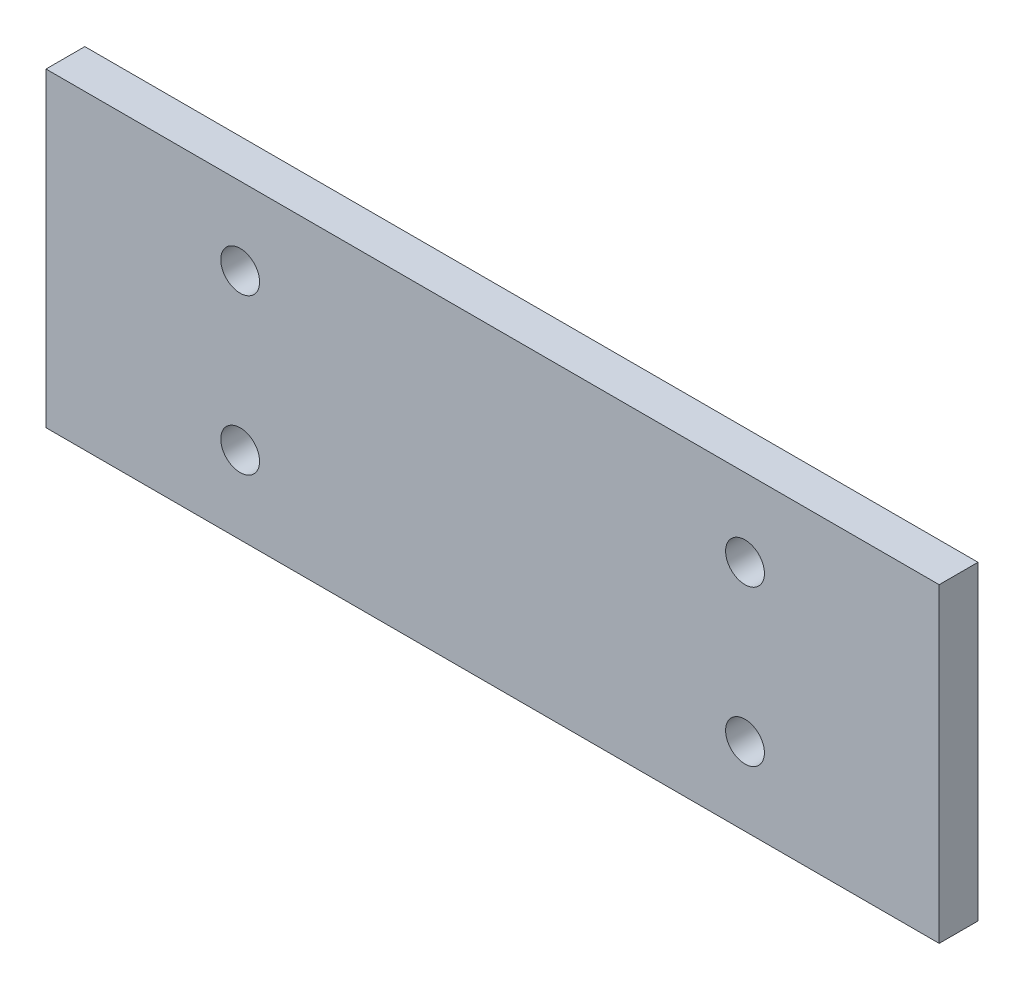
ISO-10303-21;
HEADER;
FILE_DESCRIPTION(('STEP AP214'),'2;1');
FILE_NAME('part.step','',(''),(''),'','','');
FILE_SCHEMA(('AUTOMOTIVE_DESIGN { 1 0 10303 214 1 1 1 1 }'));
ENDSEC;
DATA;
#1=APPLICATION_CONTEXT('core data for automotive mechanical design processes');
#2=APPLICATION_PROTOCOL_DEFINITION('international standard','automotive_design',2000,#1);
#3=PRODUCT_CONTEXT('',#1,'mechanical');
#4=PRODUCT('Part','Part','',(#3));
#5=PRODUCT_RELATED_PRODUCT_CATEGORY('part','',(#4));
#6=PRODUCT_DEFINITION_FORMATION('','',#4);
#7=PRODUCT_DEFINITION_CONTEXT('part definition',#1,'design');
#8=PRODUCT_DEFINITION('design','',#6,#7);
#9=PRODUCT_DEFINITION_SHAPE('','',#8);
#10=(LENGTH_UNIT() NAMED_UNIT(*) SI_UNIT(.MILLI.,.METRE.));
#11=(NAMED_UNIT(*) PLANE_ANGLE_UNIT() SI_UNIT($,.RADIAN.));
#12=(NAMED_UNIT(*) SI_UNIT($,.STERADIAN.) SOLID_ANGLE_UNIT());
#13=UNCERTAINTY_MEASURE_WITH_UNIT(LENGTH_MEASURE(1.E-05),#10,'distance_accuracy_value','');
#14=(GEOMETRIC_REPRESENTATION_CONTEXT(3) GLOBAL_UNCERTAINTY_ASSIGNED_CONTEXT((#13)) GLOBAL_UNIT_ASSIGNED_CONTEXT((#10,
#11,#12)) REPRESENTATION_CONTEXT('',''));
#15=CARTESIAN_POINT('',(0.,0.,0.));
#16=DIRECTION('',(0.,0.,1.));
#17=DIRECTION('',(1.,0.,0.));
#18=AXIS2_PLACEMENT_3D('',#15,#16,#17);
#19=CARTESIAN_POINT('',(0.,0.,5.));
#20=DIRECTION('',(0.,0.,1.));
#21=DIRECTION('',(1.,0.,0.));
#22=AXIS2_PLACEMENT_3D('',#19,#20,#21);
#23=PLANE('',#22);
#24=CARTESIAN_POINT('',(32.5,10.,5.));
#25=DIRECTION('',(0.,0.,1.));
#26=DIRECTION('',(1.,0.,0.));
#27=AXIS2_PLACEMENT_3D('',#24,#25,#26);
#28=CIRCLE('',#27,2.5);
#29=CARTESIAN_POINT('',(35.,10.,5.));
#30=VERTEX_POINT('',#29);
#31=EDGE_CURVE('E120',#30,#30,#28,.T.);
#32=ORIENTED_EDGE('',*,*,#31,.F.);
#33=EDGE_LOOP('',(#32));
#34=FACE_BOUND('',#33,.T.);
#35=CARTESIAN_POINT('',(-32.5,30.,5.));
#36=DIRECTION('',(0.,0.,1.));
#37=DIRECTION('',(1.,0.,0.));
#38=AXIS2_PLACEMENT_3D('',#35,#36,#37);
#39=CIRCLE('',#38,2.5);
#40=CARTESIAN_POINT('',(-30.,30.,5.));
#41=VERTEX_POINT('',#40);
#42=EDGE_CURVE('E99',#41,#41,#39,.T.);
#43=ORIENTED_EDGE('',*,*,#42,.F.);
#44=EDGE_LOOP('',(#43));
#45=FACE_BOUND('',#44,.T.);
#46=DIRECTION('',(0.,1.,0.));
#47=VECTOR('',#46,1.);
#48=CARTESIAN_POINT('',(57.5,40.,5.));
#49=LINE('',#48,#47);
#50=CARTESIAN_POINT('',(57.5,0.,5.));
#51=VERTEX_POINT('',#50);
#52=CARTESIAN_POINT('',(57.5,40.,5.));
#53=VERTEX_POINT('',#52);
#54=EDGE_CURVE('E84',#51,#53,#49,.T.);
#55=ORIENTED_EDGE('',*,*,#54,.T.);
#56=DIRECTION('',(-1.,0.,0.));
#57=VECTOR('',#56,1.);
#58=CARTESIAN_POINT('',(-57.5,40.,5.));
#59=LINE('',#58,#57);
#60=CARTESIAN_POINT('',(-57.5,40.,5.));
#61=VERTEX_POINT('',#60);
#62=EDGE_CURVE('E79',#53,#61,#59,.T.);
#63=ORIENTED_EDGE('',*,*,#62,.T.);
#64=DIRECTION('',(0.,-1.,0.));
#65=VECTOR('',#64,1.);
#66=CARTESIAN_POINT('',(-57.5,0.,5.));
#67=LINE('',#66,#65);
#68=CARTESIAN_POINT('',(-57.5,0.,5.));
#69=VERTEX_POINT('',#68);
#70=EDGE_CURVE('E82',#61,#69,#67,.T.);
#71=ORIENTED_EDGE('',*,*,#70,.T.);
#72=DIRECTION('',(1.,0.,0.));
#73=VECTOR('',#72,1.);
#74=CARTESIAN_POINT('',(-57.5,0.,5.));
#75=LINE('',#74,#73);
#76=EDGE_CURVE('E49',#69,#51,#75,.T.);
#77=ORIENTED_EDGE('',*,*,#76,.T.);
#78=EDGE_LOOP('',(#55,#63,#71,#77));
#79=FACE_BOUND('',#78,.T.);
#80=CARTESIAN_POINT('',(-32.5,10.,5.));
#81=DIRECTION('',(0.,0.,1.));
#82=DIRECTION('',(1.,0.,0.));
#83=AXIS2_PLACEMENT_3D('',#80,#81,#82);
#84=CIRCLE('',#83,2.5);
#85=CARTESIAN_POINT('',(-30.,10.,5.));
#86=VERTEX_POINT('',#85);
#87=EDGE_CURVE('E114',#86,#86,#84,.T.);
#88=ORIENTED_EDGE('',*,*,#87,.F.);
#89=EDGE_LOOP('',(#88));
#90=FACE_BOUND('',#89,.T.);
#91=CARTESIAN_POINT('',(32.5,30.,5.));
#92=DIRECTION('',(0.,0.,1.));
#93=DIRECTION('',(1.,0.,0.));
#94=AXIS2_PLACEMENT_3D('',#91,#92,#93);
#95=CIRCLE('',#94,2.5);
#96=CARTESIAN_POINT('',(35.,30.,5.));
#97=VERTEX_POINT('',#96);
#98=EDGE_CURVE('E126',#97,#97,#95,.T.);
#99=ORIENTED_EDGE('',*,*,#98,.F.);
#100=EDGE_LOOP('',(#99));
#101=FACE_BOUND('',#100,.T.);
#102=ADVANCED_FACE('F32',(#34,#45,#79,#90,#101),#23,.T.);
#103=CARTESIAN_POINT('',(0.,0.,0.));
#104=DIRECTION('',(0.,0.,1.));
#105=DIRECTION('',(1.,0.,0.));
#106=AXIS2_PLACEMENT_3D('',#103,#104,#105);
#107=PLANE('',#106);
#108=DIRECTION('',(0.,1.,0.));
#109=VECTOR('',#108,1.);
#110=CARTESIAN_POINT('',(57.5,40.,0.));
#111=LINE('',#110,#109);
#112=CARTESIAN_POINT('',(57.5,0.,0.));
#113=VERTEX_POINT('',#112);
#114=CARTESIAN_POINT('',(57.5,40.,0.));
#115=VERTEX_POINT('',#114);
#116=EDGE_CURVE('E96',#113,#115,#111,.T.);
#117=ORIENTED_EDGE('',*,*,#116,.F.);
#118=DIRECTION('',(1.,0.,0.));
#119=VECTOR('',#118,1.);
#120=CARTESIAN_POINT('',(-57.5,0.,0.));
#121=LINE('',#120,#119);
#122=CARTESIAN_POINT('',(-57.5,0.,0.));
#123=VERTEX_POINT('',#122);
#124=EDGE_CURVE('E72',#123,#113,#121,.T.);
#125=ORIENTED_EDGE('',*,*,#124,.F.);
#126=DIRECTION('',(0.,-1.,0.));
#127=VECTOR('',#126,1.);
#128=CARTESIAN_POINT('',(-57.5,0.,0.));
#129=LINE('',#128,#127);
#130=CARTESIAN_POINT('',(-57.5,40.,0.));
#131=VERTEX_POINT('',#130);
#132=EDGE_CURVE('E66',#131,#123,#129,.T.);
#133=ORIENTED_EDGE('',*,*,#132,.F.);
#134=DIRECTION('',(-1.,0.,0.));
#135=VECTOR('',#134,1.);
#136=CARTESIAN_POINT('',(-57.5,40.,0.));
#137=LINE('',#136,#135);
#138=EDGE_CURVE('E88',#115,#131,#137,.T.);
#139=ORIENTED_EDGE('',*,*,#138,.F.);
#140=EDGE_LOOP('',(#117,#125,#133,#139));
#141=FACE_BOUND('',#140,.T.);
#142=CARTESIAN_POINT('',(-32.5,30.,0.));
#143=DIRECTION('',(0.,0.,1.));
#144=DIRECTION('',(1.,0.,0.));
#145=AXIS2_PLACEMENT_3D('',#142,#143,#144);
#146=CIRCLE('',#145,2.5);
#147=CARTESIAN_POINT('',(-30.,30.,0.));
#148=VERTEX_POINT('',#147);
#149=EDGE_CURVE('E111',#148,#148,#146,.T.);
#150=ORIENTED_EDGE('',*,*,#149,.T.);
#151=EDGE_LOOP('',(#150));
#152=FACE_BOUND('',#151,.T.);
#153=CARTESIAN_POINT('',(-32.5,10.,0.));
#154=DIRECTION('',(0.,0.,1.));
#155=DIRECTION('',(1.,0.,0.));
#156=AXIS2_PLACEMENT_3D('',#153,#154,#155);
#157=CIRCLE('',#156,2.5);
#158=CARTESIAN_POINT('',(-30.,10.,0.));
#159=VERTEX_POINT('',#158);
#160=EDGE_CURVE('E117',#159,#159,#157,.T.);
#161=ORIENTED_EDGE('',*,*,#160,.T.);
#162=EDGE_LOOP('',(#161));
#163=FACE_BOUND('',#162,.T.);
#164=CARTESIAN_POINT('',(32.5,10.,0.));
#165=DIRECTION('',(0.,0.,1.));
#166=DIRECTION('',(1.,0.,0.));
#167=AXIS2_PLACEMENT_3D('',#164,#165,#166);
#168=CIRCLE('',#167,2.5);
#169=CARTESIAN_POINT('',(35.,10.,0.));
#170=VERTEX_POINT('',#169);
#171=EDGE_CURVE('E123',#170,#170,#168,.T.);
#172=ORIENTED_EDGE('',*,*,#171,.T.);
#173=EDGE_LOOP('',(#172));
#174=FACE_BOUND('',#173,.T.);
#175=CARTESIAN_POINT('',(32.5,30.,0.));
#176=DIRECTION('',(0.,0.,1.));
#177=DIRECTION('',(1.,0.,0.));
#178=AXIS2_PLACEMENT_3D('',#175,#176,#177);
#179=CIRCLE('',#178,2.5);
#180=CARTESIAN_POINT('',(35.,30.,0.));
#181=VERTEX_POINT('',#180);
#182=EDGE_CURVE('E129',#181,#181,#179,.T.);
#183=ORIENTED_EDGE('',*,*,#182,.T.);
#184=EDGE_LOOP('',(#183));
#185=FACE_BOUND('',#184,.T.);
#186=ADVANCED_FACE('F107',(#141,#152,#163,#174,#185),#107,.F.);
#187=CARTESIAN_POINT('',(57.5,40.,5.));
#188=DIRECTION('',(-1.,0.,0.));
#189=DIRECTION('',(0.,0.,1.));
#190=AXIS2_PLACEMENT_3D('',#187,#188,#189);
#191=PLANE('',#190);
#192=ORIENTED_EDGE('',*,*,#116,.T.);
#193=DIRECTION('',(0.,0.,-1.));
#194=VECTOR('',#193,1.);
#195=CARTESIAN_POINT('',(57.5,40.,5.));
#196=LINE('',#195,#194);
#197=EDGE_CURVE('E11',#53,#115,#196,.T.);
#198=ORIENTED_EDGE('',*,*,#197,.F.);
#199=ORIENTED_EDGE('',*,*,#54,.F.);
#200=DIRECTION('',(0.,0.,-1.));
#201=VECTOR('',#200,1.);
#202=CARTESIAN_POINT('',(57.5,0.,5.));
#203=LINE('',#202,#201);
#204=EDGE_CURVE('E92',#51,#113,#203,.T.);
#205=ORIENTED_EDGE('',*,*,#204,.T.);
#206=EDGE_LOOP('',(#192,#198,#199,#205));
#207=FACE_BOUND('',#206,.T.);
#208=ADVANCED_FACE('F34',(#207),#191,.F.);
#209=CARTESIAN_POINT('',(-57.5,40.,5.));
#210=DIRECTION('',(0.,-1.,0.));
#211=DIRECTION('',(0.,0.,-1.));
#212=AXIS2_PLACEMENT_3D('',#209,#210,#211);
#213=PLANE('',#212);
#214=ORIENTED_EDGE('',*,*,#138,.T.);
#215=DIRECTION('',(0.,0.,-1.));
#216=VECTOR('',#215,1.);
#217=CARTESIAN_POINT('',(-57.5,40.,5.));
#218=LINE('',#217,#216);
#219=EDGE_CURVE('E41',#61,#131,#218,.T.);
#220=ORIENTED_EDGE('',*,*,#219,.F.);
#221=ORIENTED_EDGE('',*,*,#62,.F.);
#222=ORIENTED_EDGE('',*,*,#197,.T.);
#223=EDGE_LOOP('',(#214,#220,#221,#222));
#224=FACE_BOUND('',#223,.T.);
#225=ADVANCED_FACE('F87',(#224),#213,.F.);
#226=CARTESIAN_POINT('',(-57.5,0.,5.));
#227=DIRECTION('',(1.,0.,0.));
#228=DIRECTION('',(0.,0.,-1.));
#229=AXIS2_PLACEMENT_3D('',#226,#227,#228);
#230=PLANE('',#229);
#231=ORIENTED_EDGE('',*,*,#132,.T.);
#232=DIRECTION('',(0.,0.,-1.));
#233=VECTOR('',#232,1.);
#234=CARTESIAN_POINT('',(-57.5,0.,5.));
#235=LINE('',#234,#233);
#236=EDGE_CURVE('E89',#69,#123,#235,.T.);
#237=ORIENTED_EDGE('',*,*,#236,.F.);
#238=ORIENTED_EDGE('',*,*,#70,.F.);
#239=ORIENTED_EDGE('',*,*,#219,.T.);
#240=EDGE_LOOP('',(#231,#237,#238,#239));
#241=FACE_BOUND('',#240,.T.);
#242=ADVANCED_FACE('F90',(#241),#230,.F.);
#243=CARTESIAN_POINT('',(-57.5,0.,5.));
#244=DIRECTION('',(0.,1.,0.));
#245=DIRECTION('',(0.,0.,1.));
#246=AXIS2_PLACEMENT_3D('',#243,#244,#245);
#247=PLANE('',#246);
#248=ORIENTED_EDGE('',*,*,#124,.T.);
#249=ORIENTED_EDGE('',*,*,#204,.F.);
#250=ORIENTED_EDGE('',*,*,#76,.F.);
#251=ORIENTED_EDGE('',*,*,#236,.T.);
#252=EDGE_LOOP('',(#248,#249,#250,#251));
#253=FACE_BOUND('',#252,.T.);
#254=ADVANCED_FACE('F104',(#253),#247,.F.);
#255=CARTESIAN_POINT('',(-32.5,30.,5.));
#256=DIRECTION('',(0.,0.,-1.));
#257=DIRECTION('',(-1.,0.,0.));
#258=AXIS2_PLACEMENT_3D('',#255,#256,#257);
#259=CYLINDRICAL_SURFACE('',#258,2.5);
#260=ORIENTED_EDGE('',*,*,#42,.T.);
#261=EDGE_LOOP('',(#260));
#262=FACE_BOUND('',#261,.T.);
#263=ORIENTED_EDGE('',*,*,#149,.F.);
#264=EDGE_LOOP('',(#263));
#265=FACE_BOUND('',#264,.T.);
#266=ADVANCED_FACE('F148',(#262,#265),#259,.F.);
#267=CARTESIAN_POINT('',(-32.5,10.,5.));
#268=DIRECTION('',(0.,0.,-1.));
#269=DIRECTION('',(-1.,0.,0.));
#270=AXIS2_PLACEMENT_3D('',#267,#268,#269);
#271=CYLINDRICAL_SURFACE('',#270,2.5);
#272=ORIENTED_EDGE('',*,*,#87,.T.);
#273=EDGE_LOOP('',(#272));
#274=FACE_BOUND('',#273,.T.);
#275=ORIENTED_EDGE('',*,*,#160,.F.);
#276=EDGE_LOOP('',(#275));
#277=FACE_BOUND('',#276,.T.);
#278=ADVANCED_FACE('F194',(#274,#277),#271,.F.);
#279=CARTESIAN_POINT('',(32.5,10.,5.));
#280=DIRECTION('',(0.,0.,-1.));
#281=DIRECTION('',(-1.,0.,0.));
#282=AXIS2_PLACEMENT_3D('',#279,#280,#281);
#283=CYLINDRICAL_SURFACE('',#282,2.5);
#284=ORIENTED_EDGE('',*,*,#31,.T.);
#285=EDGE_LOOP('',(#284));
#286=FACE_BOUND('',#285,.T.);
#287=ORIENTED_EDGE('',*,*,#171,.F.);
#288=EDGE_LOOP('',(#287));
#289=FACE_BOUND('',#288,.T.);
#290=ADVANCED_FACE('F202',(#286,#289),#283,.F.);
#291=CARTESIAN_POINT('',(32.5,30.,5.));
#292=DIRECTION('',(0.,0.,-1.));
#293=DIRECTION('',(-1.,0.,0.));
#294=AXIS2_PLACEMENT_3D('',#291,#292,#293);
#295=CYLINDRICAL_SURFACE('',#294,2.5);
#296=ORIENTED_EDGE('',*,*,#98,.T.);
#297=EDGE_LOOP('',(#296));
#298=FACE_BOUND('',#297,.T.);
#299=ORIENTED_EDGE('',*,*,#182,.F.);
#300=EDGE_LOOP('',(#299));
#301=FACE_BOUND('',#300,.T.);
#302=ADVANCED_FACE('F135',(#298,#301),#295,.F.);
#303=CLOSED_SHELL('',(#102,#186,#208,#225,#242,#254,#266,#278,#290,#302));
#304=MANIFOLD_SOLID_BREP('B2',#303);
#305=ADVANCED_BREP_SHAPE_REPRESENTATION('',(#18,#304),#14);
#306=SHAPE_DEFINITION_REPRESENTATION(#9,#305);
ENDSEC;
END-ISO-10303-21;
